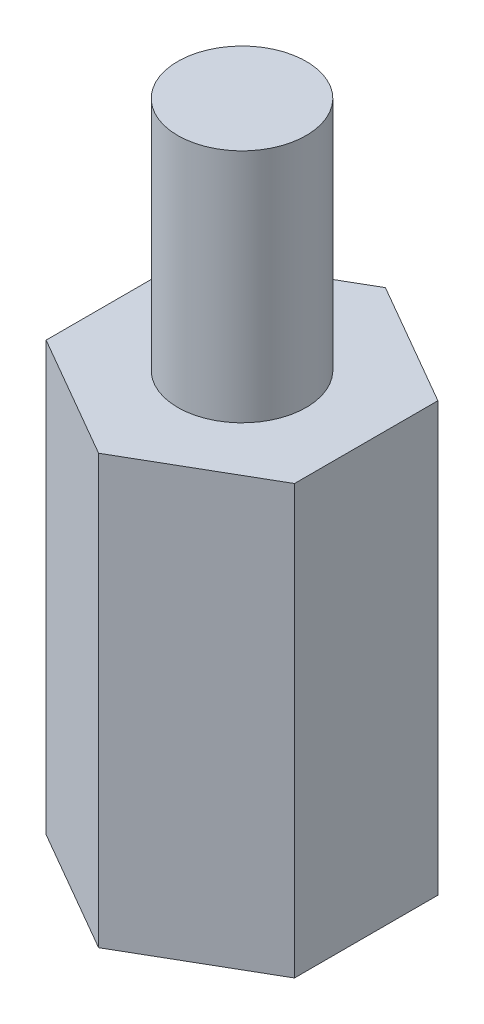
ISO-10303-21;
HEADER;
FILE_DESCRIPTION(('STEP AP214'),'2;1');
FILE_NAME('part.step','',(''),(''),'','','');
FILE_SCHEMA(('AUTOMOTIVE_DESIGN { 1 0 10303 214 1 1 1 1 }'));
ENDSEC;
DATA;
#1=APPLICATION_CONTEXT('core data for automotive mechanical design processes');
#2=APPLICATION_PROTOCOL_DEFINITION('international standard','automotive_design',2000,#1);
#3=PRODUCT_CONTEXT('',#1,'mechanical');
#4=PRODUCT('Part','Part','',(#3));
#5=PRODUCT_RELATED_PRODUCT_CATEGORY('part','',(#4));
#6=PRODUCT_DEFINITION_FORMATION('','',#4);
#7=PRODUCT_DEFINITION_CONTEXT('part definition',#1,'design');
#8=PRODUCT_DEFINITION('design','',#6,#7);
#9=PRODUCT_DEFINITION_SHAPE('','',#8);
#10=(LENGTH_UNIT() NAMED_UNIT(*) SI_UNIT(.MILLI.,.METRE.));
#11=(NAMED_UNIT(*) PLANE_ANGLE_UNIT() SI_UNIT($,.RADIAN.));
#12=(NAMED_UNIT(*) SI_UNIT($,.STERADIAN.) SOLID_ANGLE_UNIT());
#13=UNCERTAINTY_MEASURE_WITH_UNIT(LENGTH_MEASURE(1.E-05),#10,'distance_accuracy_value','');
#14=(GEOMETRIC_REPRESENTATION_CONTEXT(3) GLOBAL_UNCERTAINTY_ASSIGNED_CONTEXT((#13)) GLOBAL_UNIT_ASSIGNED_CONTEXT((#10,
#11,#12)) REPRESENTATION_CONTEXT('',''));
#15=CARTESIAN_POINT('',(0.,0.,0.));
#16=DIRECTION('',(0.,0.,1.));
#17=DIRECTION('',(1.,0.,0.));
#18=AXIS2_PLACEMENT_3D('',#15,#16,#17);
#19=CARTESIAN_POINT('',(0.,10.5,0.));
#20=DIRECTION('',(0.,-1.,0.));
#21=DIRECTION('',(0.,0.,-1.));
#22=AXIS2_PLACEMENT_3D('',#19,#20,#21);
#23=CYLINDRICAL_SURFACE('',#22,1.5);
#24=CARTESIAN_POINT('',(0.,10.5,0.));
#25=DIRECTION('',(0.,1.,0.));
#26=DIRECTION('',(0.,0.,1.));
#27=AXIS2_PLACEMENT_3D('',#24,#25,#26);
#28=CIRCLE('',#27,1.5);
#29=CARTESIAN_POINT('',(0.,10.5,1.5));
#30=VERTEX_POINT('',#29);
#31=EDGE_CURVE('E11',#30,#30,#28,.T.);
#32=ORIENTED_EDGE('',*,*,#31,.F.);
#33=EDGE_LOOP('',(#32));
#34=FACE_BOUND('',#33,.T.);
#35=CARTESIAN_POINT('',(0.,5.,0.));
#36=DIRECTION('',(0.,1.,0.));
#37=DIRECTION('',(0.,0.,1.));
#38=AXIS2_PLACEMENT_3D('',#35,#36,#37);
#39=CIRCLE('',#38,1.5);
#40=CARTESIAN_POINT('',(0.,5.,1.5));
#41=VERTEX_POINT('',#40);
#42=EDGE_CURVE('E44',#41,#41,#39,.T.);
#43=ORIENTED_EDGE('',*,*,#42,.T.);
#44=EDGE_LOOP('',(#43));
#45=FACE_BOUND('',#44,.T.);
#46=ADVANCED_FACE('F41',(#34,#45),#23,.T.);
#47=CARTESIAN_POINT('',(0.,10.5,0.));
#48=DIRECTION('',(0.,1.,0.));
#49=DIRECTION('',(0.,0.,1.));
#50=AXIS2_PLACEMENT_3D('',#47,#48,#49);
#51=PLANE('',#50);
#52=ORIENTED_EDGE('',*,*,#31,.T.);
#53=EDGE_LOOP('',(#52));
#54=FACE_BOUND('',#53,.T.);
#55=ADVANCED_FACE('F56',(#54),#51,.T.);
#56=CARTESIAN_POINT('',(0.,5.,0.));
#57=DIRECTION('',(0.,1.,0.));
#58=DIRECTION('',(0.,0.,1.));
#59=AXIS2_PLACEMENT_3D('',#56,#57,#58);
#60=PLANE('',#59);
#61=ORIENTED_EDGE('',*,*,#42,.F.);
#62=EDGE_LOOP('',(#61));
#63=FACE_BOUND('',#62,.T.);
#64=ADVANCED_FACE('F54',(#63),#60,.F.);
#65=CLOSED_SHELL('',(#46,#55,#64));
#66=MANIFOLD_SOLID_BREP('B2',#65);
#67=CARTESIAN_POINT('',(0.,5.,0.));
#68=DIRECTION('',(0.,1.,0.));
#69=DIRECTION('',(0.,0.,1.));
#70=AXIS2_PLACEMENT_3D('',#67,#68,#69);
#71=PLANE('',#70);
#72=DIRECTION('',(0.866025403784442,0.,0.499999999999995));
#73=VECTOR('',#72,1.);
#74=CARTESIAN_POINT('',(-2.89999999999998,5.,1.67431578064995));
#75=LINE('',#74,#73);
#76=CARTESIAN_POINT('',(-2.89999999999998,5.,1.67431578064995));
#77=VERTEX_POINT('',#76);
#78=CARTESIAN_POINT('',(0.,5.,3.34863156129983));
#79=VERTEX_POINT('',#78);
#80=EDGE_CURVE('E178',#77,#79,#75,.T.);
#81=ORIENTED_EDGE('',*,*,#80,.T.);
#82=DIRECTION('',(0.866025403784438,0.,-0.500000000000001));
#83=VECTOR('',#82,1.);
#84=CARTESIAN_POINT('',(0.,5.,3.34863156129983));
#85=LINE('',#84,#83);
#86=CARTESIAN_POINT('',(2.90000000000001,5.,1.67431578064991));
#87=VERTEX_POINT('',#86);
#88=EDGE_CURVE('E136',#79,#87,#85,.T.);
#89=ORIENTED_EDGE('',*,*,#88,.T.);
#90=DIRECTION('',(0.,0.,-1.));
#91=VECTOR('',#90,1.);
#92=CARTESIAN_POINT('',(2.90000000000001,5.,1.67431578064991));
#93=LINE('',#92,#91);
#94=CARTESIAN_POINT('',(2.89999999999999,5.,-1.67431578064993));
#95=VERTEX_POINT('',#94);
#96=EDGE_CURVE('E149',#87,#95,#93,.T.);
#97=ORIENTED_EDGE('',*,*,#96,.T.);
#98=DIRECTION('',(-0.866025403784442,0.,-0.499999999999995));
#99=VECTOR('',#98,1.);
#100=CARTESIAN_POINT('',(2.89999999999999,5.,-1.67431578064993));
#101=LINE('',#100,#99);
#102=CARTESIAN_POINT('',(0.,5.,-3.34863156129983));
#103=VERTEX_POINT('',#102);
#104=EDGE_CURVE('E143',#95,#103,#101,.T.);
#105=ORIENTED_EDGE('',*,*,#104,.T.);
#106=DIRECTION('',(-0.866025403784435,0.,0.500000000000007));
#107=VECTOR('',#106,1.);
#108=CARTESIAN_POINT('',(0.,5.,-3.34863156129983));
#109=LINE('',#108,#107);
#110=CARTESIAN_POINT('',(-2.90000000000002,5.,-1.67431578064989));
#111=VERTEX_POINT('',#110);
#112=EDGE_CURVE('E147',#103,#111,#109,.T.);
#113=ORIENTED_EDGE('',*,*,#112,.T.);
#114=DIRECTION('',(0.,0.,1.));
#115=VECTOR('',#114,1.);
#116=CARTESIAN_POINT('',(-2.90000000000002,5.,-1.67431578064989));
#117=LINE('',#116,#115);
#118=EDGE_CURVE('E99',#111,#77,#117,.T.);
#119=ORIENTED_EDGE('',*,*,#118,.T.);
#120=EDGE_LOOP('',(#81,#89,#97,#105,#113,#119));
#121=FACE_BOUND('',#120,.T.);
#122=CARTESIAN_POINT('',(0.,5.,0.));
#123=DIRECTION('',(0.,1.,0.));
#124=DIRECTION('',(0.,0.,1.));
#125=AXIS2_PLACEMENT_3D('',#122,#123,#124);
#126=CIRCLE('',#125,1.5);
#127=CARTESIAN_POINT('',(0.,5.,1.5));
#128=VERTEX_POINT('',#127);
#129=EDGE_CURVE('E171',#128,#128,#126,.T.);
#130=ORIENTED_EDGE('',*,*,#129,.F.);
#131=EDGE_LOOP('',(#130));
#132=FACE_BOUND('',#131,.T.);
#133=ADVANCED_FACE('F82',(#121,#132),#71,.T.);
#134=CARTESIAN_POINT('',(0.,-5.,0.));
#135=DIRECTION('',(0.,1.,0.));
#136=DIRECTION('',(0.,0.,1.));
#137=AXIS2_PLACEMENT_3D('',#134,#135,#136);
#138=PLANE('',#137);
#139=DIRECTION('',(0.866025403784442,0.,0.499999999999995));
#140=VECTOR('',#139,1.);
#141=CARTESIAN_POINT('',(-2.89999999999998,-5.,1.67431578064995));
#142=LINE('',#141,#140);
#143=CARTESIAN_POINT('',(-2.89999999999998,-5.,1.67431578064995));
#144=VERTEX_POINT('',#143);
#145=CARTESIAN_POINT('',(0.,-5.,3.34863156129983));
#146=VERTEX_POINT('',#145);
#147=EDGE_CURVE('E167',#144,#146,#142,.T.);
#148=ORIENTED_EDGE('',*,*,#147,.F.);
#149=DIRECTION('',(0.,0.,1.));
#150=VECTOR('',#149,1.);
#151=CARTESIAN_POINT('',(-2.90000000000002,-5.,-1.67431578064989));
#152=LINE('',#151,#150);
#153=CARTESIAN_POINT('',(-2.90000000000002,-5.,-1.67431578064989));
#154=VERTEX_POINT('',#153);
#155=EDGE_CURVE('E128',#154,#144,#152,.T.);
#156=ORIENTED_EDGE('',*,*,#155,.F.);
#157=DIRECTION('',(-0.866025403784435,0.,0.500000000000007));
#158=VECTOR('',#157,1.);
#159=CARTESIAN_POINT('',(0.,-5.,-3.34863156129983));
#160=LINE('',#159,#158);
#161=CARTESIAN_POINT('',(0.,-5.,-3.34863156129983));
#162=VERTEX_POINT('',#161);
#163=EDGE_CURVE('E122',#162,#154,#160,.T.);
#164=ORIENTED_EDGE('',*,*,#163,.F.);
#165=DIRECTION('',(-0.866025403784442,0.,-0.499999999999995));
#166=VECTOR('',#165,1.);
#167=CARTESIAN_POINT('',(2.89999999999999,-5.,-1.67431578064993));
#168=LINE('',#167,#166);
#169=CARTESIAN_POINT('',(2.89999999999999,-5.,-1.67431578064993));
#170=VERTEX_POINT('',#169);
#171=EDGE_CURVE('E157',#170,#162,#168,.T.);
#172=ORIENTED_EDGE('',*,*,#171,.F.);
#173=DIRECTION('',(0.,0.,-1.));
#174=VECTOR('',#173,1.);
#175=CARTESIAN_POINT('',(2.90000000000001,-5.,1.67431578064991));
#176=LINE('',#175,#174);
#177=CARTESIAN_POINT('',(2.90000000000001,-5.,1.67431578064991));
#178=VERTEX_POINT('',#177);
#179=EDGE_CURVE('E173',#178,#170,#176,.T.);
#180=ORIENTED_EDGE('',*,*,#179,.F.);
#181=DIRECTION('',(0.866025403784438,0.,-0.500000000000001));
#182=VECTOR('',#181,1.);
#183=CARTESIAN_POINT('',(0.,-5.,3.34863156129983));
#184=LINE('',#183,#182);
#185=EDGE_CURVE('E170',#146,#178,#184,.T.);
#186=ORIENTED_EDGE('',*,*,#185,.F.);
#187=EDGE_LOOP('',(#148,#156,#164,#172,#180,#186));
#188=FACE_BOUND('',#187,.T.);
#189=CARTESIAN_POINT('',(0.,-5.,0.));
#190=DIRECTION('',(0.,1.,0.));
#191=DIRECTION('',(0.,0.,1.));
#192=AXIS2_PLACEMENT_3D('',#189,#190,#191);
#193=CIRCLE('',#192,1.5);
#194=CARTESIAN_POINT('',(0.,-5.,1.5));
#195=VERTEX_POINT('',#194);
#196=EDGE_CURVE('E271',#195,#195,#193,.T.);
#197=ORIENTED_EDGE('',*,*,#196,.T.);
#198=EDGE_LOOP('',(#197));
#199=FACE_BOUND('',#198,.T.);
#200=ADVANCED_FACE('F187',(#188,#199),#138,.F.);
#201=CARTESIAN_POINT('',(-2.89999999999998,5.,1.67431578064995));
#202=DIRECTION('',(0.499999999999995,0.,-0.866025403784442));
#203=DIRECTION('',(-0.866025403784442,0.,-0.499999999999995));
#204=AXIS2_PLACEMENT_3D('',#201,#202,#203);
#205=PLANE('',#204);
#206=ORIENTED_EDGE('',*,*,#147,.T.);
#207=DIRECTION('',(0.,-1.,0.));
#208=VECTOR('',#207,1.);
#209=CARTESIAN_POINT('',(0.,5.,3.34863156129983));
#210=LINE('',#209,#208);
#211=EDGE_CURVE('E39',#79,#146,#210,.T.);
#212=ORIENTED_EDGE('',*,*,#211,.F.);
#213=ORIENTED_EDGE('',*,*,#80,.F.);
#214=DIRECTION('',(0.,-1.,0.));
#215=VECTOR('',#214,1.);
#216=CARTESIAN_POINT('',(-2.89999999999998,5.,1.67431578064995));
#217=LINE('',#216,#215);
#218=EDGE_CURVE('E163',#77,#144,#217,.T.);
#219=ORIENTED_EDGE('',*,*,#218,.T.);
#220=EDGE_LOOP('',(#206,#212,#213,#219));
#221=FACE_BOUND('',#220,.T.);
#222=ADVANCED_FACE('F84',(#221),#205,.F.);
#223=CARTESIAN_POINT('',(0.,5.,3.34863156129983));
#224=DIRECTION('',(-0.500000000000001,0.,-0.866025403784438));
#225=DIRECTION('',(-0.866025403784438,0.,0.500000000000001));
#226=AXIS2_PLACEMENT_3D('',#223,#224,#225);
#227=PLANE('',#226);
#228=ORIENTED_EDGE('',*,*,#185,.T.);
#229=DIRECTION('',(0.,-1.,0.));
#230=VECTOR('',#229,1.);
#231=CARTESIAN_POINT('',(2.90000000000001,5.,1.67431578064991));
#232=LINE('',#231,#230);
#233=EDGE_CURVE('E91',#87,#178,#232,.T.);
#234=ORIENTED_EDGE('',*,*,#233,.F.);
#235=ORIENTED_EDGE('',*,*,#88,.F.);
#236=ORIENTED_EDGE('',*,*,#211,.T.);
#237=EDGE_LOOP('',(#228,#234,#235,#236));
#238=FACE_BOUND('',#237,.T.);
#239=ADVANCED_FACE('F212',(#238),#227,.F.);
#240=CARTESIAN_POINT('',(2.90000000000001,5.,1.67431578064991));
#241=DIRECTION('',(-1.,0.,0.));
#242=DIRECTION('',(0.,0.,1.));
#243=AXIS2_PLACEMENT_3D('',#240,#241,#242);
#244=PLANE('',#243);
#245=ORIENTED_EDGE('',*,*,#179,.T.);
#246=DIRECTION('',(0.,-1.,0.));
#247=VECTOR('',#246,1.);
#248=CARTESIAN_POINT('',(2.89999999999999,5.,-1.67431578064993));
#249=LINE('',#248,#247);
#250=EDGE_CURVE('E158',#95,#170,#249,.T.);
#251=ORIENTED_EDGE('',*,*,#250,.F.);
#252=ORIENTED_EDGE('',*,*,#96,.F.);
#253=ORIENTED_EDGE('',*,*,#233,.T.);
#254=EDGE_LOOP('',(#245,#251,#252,#253));
#255=FACE_BOUND('',#254,.T.);
#256=ADVANCED_FACE('F184',(#255),#244,.F.);
#257=CARTESIAN_POINT('',(2.89999999999999,5.,-1.67431578064993));
#258=DIRECTION('',(-0.499999999999995,0.,0.866025403784442));
#259=DIRECTION('',(0.866025403784442,0.,0.499999999999995));
#260=AXIS2_PLACEMENT_3D('',#257,#258,#259);
#261=PLANE('',#260);
#262=ORIENTED_EDGE('',*,*,#171,.T.);
#263=DIRECTION('',(0.,-1.,0.));
#264=VECTOR('',#263,1.);
#265=CARTESIAN_POINT('',(0.,5.,-3.34863156129983));
#266=LINE('',#265,#264);
#267=EDGE_CURVE('E154',#103,#162,#266,.T.);
#268=ORIENTED_EDGE('',*,*,#267,.F.);
#269=ORIENTED_EDGE('',*,*,#104,.F.);
#270=ORIENTED_EDGE('',*,*,#250,.T.);
#271=EDGE_LOOP('',(#262,#268,#269,#270));
#272=FACE_BOUND('',#271,.T.);
#273=ADVANCED_FACE('F155',(#272),#261,.F.);
#274=CARTESIAN_POINT('',(0.,5.,-3.34863156129983));
#275=DIRECTION('',(0.500000000000007,0.,0.866025403784435));
#276=DIRECTION('',(0.866025403784435,0.,-0.500000000000007));
#277=AXIS2_PLACEMENT_3D('',#274,#275,#276);
#278=PLANE('',#277);
#279=ORIENTED_EDGE('',*,*,#163,.T.);
#280=DIRECTION('',(0.,-1.,0.));
#281=VECTOR('',#280,1.);
#282=CARTESIAN_POINT('',(-2.90000000000002,5.,-1.67431578064989));
#283=LINE('',#282,#281);
#284=EDGE_CURVE('E159',#111,#154,#283,.T.);
#285=ORIENTED_EDGE('',*,*,#284,.F.);
#286=ORIENTED_EDGE('',*,*,#112,.F.);
#287=ORIENTED_EDGE('',*,*,#267,.T.);
#288=EDGE_LOOP('',(#279,#285,#286,#287));
#289=FACE_BOUND('',#288,.T.);
#290=ADVANCED_FACE('F161',(#289),#278,.F.);
#291=CARTESIAN_POINT('',(-2.90000000000002,5.,-1.67431578064989));
#292=DIRECTION('',(1.,0.,0.));
#293=DIRECTION('',(0.,0.,-1.));
#294=AXIS2_PLACEMENT_3D('',#291,#292,#293);
#295=PLANE('',#294);
#296=ORIENTED_EDGE('',*,*,#155,.T.);
#297=ORIENTED_EDGE('',*,*,#218,.F.);
#298=ORIENTED_EDGE('',*,*,#118,.F.);
#299=ORIENTED_EDGE('',*,*,#284,.T.);
#300=EDGE_LOOP('',(#296,#297,#298,#299));
#301=FACE_BOUND('',#300,.T.);
#302=ADVANCED_FACE('F192',(#301),#295,.F.);
#303=CARTESIAN_POINT('',(0.,5.,0.));
#304=DIRECTION('',(0.,-1.,0.));
#305=DIRECTION('',(0.,0.,-1.));
#306=AXIS2_PLACEMENT_3D('',#303,#304,#305);
#307=CYLINDRICAL_SURFACE('',#306,1.5);
#308=ORIENTED_EDGE('',*,*,#129,.T.);
#309=EDGE_LOOP('',(#308));
#310=FACE_BOUND('',#309,.T.);
#311=ORIENTED_EDGE('',*,*,#196,.F.);
#312=EDGE_LOOP('',(#311));
#313=FACE_BOUND('',#312,.T.);
#314=ADVANCED_FACE('F194',(#310,#313),#307,.F.);
#315=CLOSED_SHELL('',(#133,#200,#222,#239,#256,#273,#290,#302,#314));
#316=MANIFOLD_SOLID_BREP('B6',#315);
#317=ADVANCED_BREP_SHAPE_REPRESENTATION('',(#18,#66,#316),#14);
#318=SHAPE_DEFINITION_REPRESENTATION(#9,#317);
ENDSEC;
END-ISO-10303-21;
